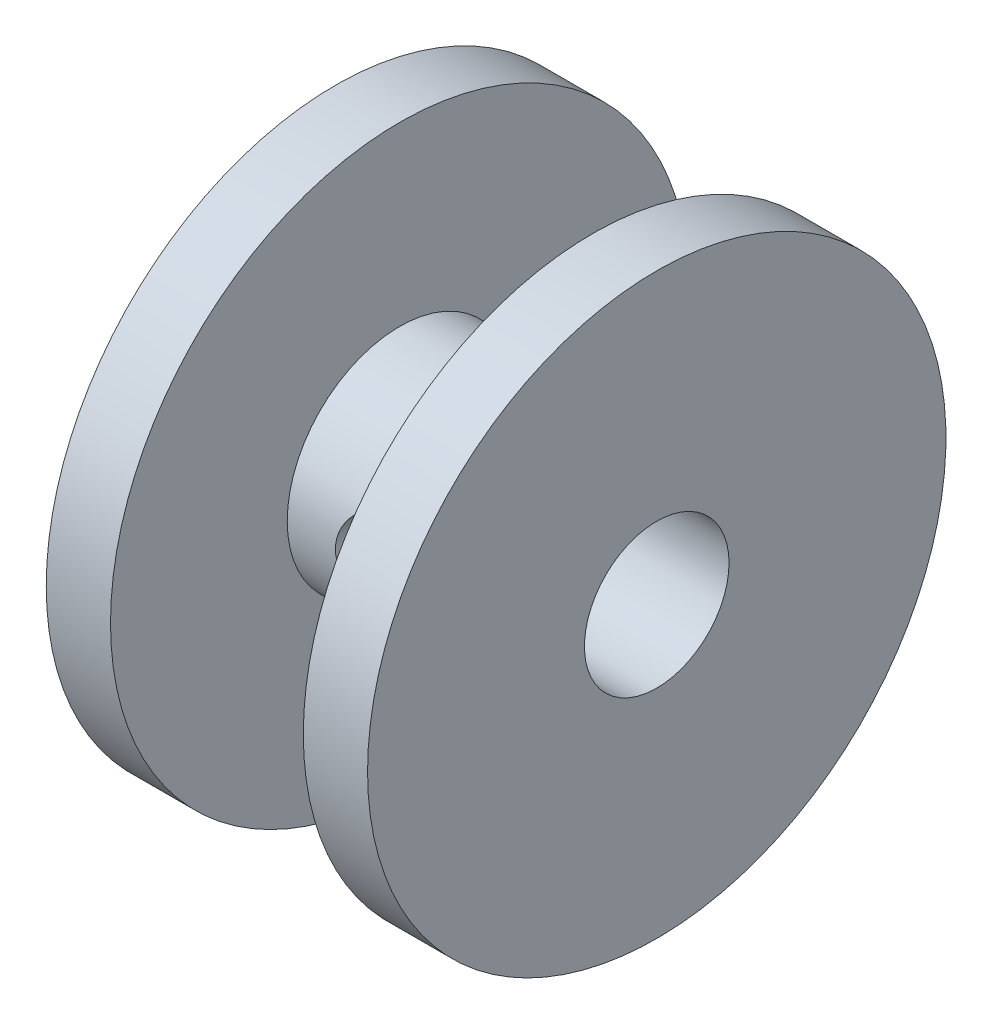
ISO-10303-21;
HEADER;
FILE_DESCRIPTION(('STEP AP214'),'2;1');
FILE_NAME('part.step','',(''),(''),'','','');
FILE_SCHEMA(('AUTOMOTIVE_DESIGN { 1 0 10303 214 1 1 1 1 }'));
ENDSEC;
DATA;
#1=APPLICATION_CONTEXT('core data for automotive mechanical design processes');
#2=APPLICATION_PROTOCOL_DEFINITION('international standard','automotive_design',2000,#1);
#3=PRODUCT_CONTEXT('',#1,'mechanical');
#4=PRODUCT('Part','Part','',(#3));
#5=PRODUCT_RELATED_PRODUCT_CATEGORY('part','',(#4));
#6=PRODUCT_DEFINITION_FORMATION('','',#4);
#7=PRODUCT_DEFINITION_CONTEXT('part definition',#1,'design');
#8=PRODUCT_DEFINITION('design','',#6,#7);
#9=PRODUCT_DEFINITION_SHAPE('','',#8);
#10=(LENGTH_UNIT() NAMED_UNIT(*) SI_UNIT(.MILLI.,.METRE.));
#11=(NAMED_UNIT(*) PLANE_ANGLE_UNIT() SI_UNIT($,.RADIAN.));
#12=(NAMED_UNIT(*) SI_UNIT($,.STERADIAN.) SOLID_ANGLE_UNIT());
#13=UNCERTAINTY_MEASURE_WITH_UNIT(LENGTH_MEASURE(1.E-05),#10,'distance_accuracy_value','');
#14=(GEOMETRIC_REPRESENTATION_CONTEXT(3) GLOBAL_UNCERTAINTY_ASSIGNED_CONTEXT((#13)) GLOBAL_UNIT_ASSIGNED_CONTEXT((#10,
#11,#12)) REPRESENTATION_CONTEXT('',''));
#15=CARTESIAN_POINT('',(0.,0.,0.));
#16=DIRECTION('',(0.,0.,1.));
#17=DIRECTION('',(1.,0.,0.));
#18=AXIS2_PLACEMENT_3D('',#15,#16,#17);
#19=CARTESIAN_POINT('',(-85.1360818211514,-19.2560029817697,0.));
#20=DIRECTION('',(-1.,0.,0.));
#21=DIRECTION('',(0.,0.,1.));
#22=AXIS2_PLACEMENT_3D('',#19,#20,#21);
#23=CYLINDRICAL_SURFACE('',#22,9.);
#24=CARTESIAN_POINT('',(-85.1360818211514,-19.2560029817697,0.));
#25=DIRECTION('',(-1.,0.,0.));
#26=DIRECTION('',(0.,0.,1.));
#27=AXIS2_PLACEMENT_3D('',#24,#25,#26);
#28=CIRCLE('',#27,9.);
#29=CARTESIAN_POINT('',(-85.1360818211514,-19.2560029817697,9.));
#30=VERTEX_POINT('',#29);
#31=EDGE_CURVE('E10',#30,#30,#28,.T.);
#32=ORIENTED_EDGE('',*,*,#31,.F.);
#33=EDGE_LOOP('',(#32));
#34=FACE_BOUND('',#33,.T.);
#35=CARTESIAN_POINT('',(-83.1360818211514,-19.2560029817697,0.));
#36=DIRECTION('',(-1.,0.,0.));
#37=DIRECTION('',(0.,0.,1.));
#38=AXIS2_PLACEMENT_3D('',#35,#36,#37);
#39=CIRCLE('',#38,9.);
#40=CARTESIAN_POINT('',(-83.1360818211514,-19.2560029817697,9.));
#41=VERTEX_POINT('',#40);
#42=EDGE_CURVE('E120',#41,#41,#39,.T.);
#43=ORIENTED_EDGE('',*,*,#42,.T.);
#44=EDGE_LOOP('',(#43));
#45=FACE_BOUND('',#44,.T.);
#46=ADVANCED_FACE('F37',(#34,#45),#23,.T.);
#47=CARTESIAN_POINT('',(-85.1360818211514,-10.2560029817697,0.));
#48=DIRECTION('',(1.,0.,0.));
#49=DIRECTION('',(0.,0.,-1.));
#50=AXIS2_PLACEMENT_3D('',#47,#48,#49);
#51=PLANE('',#50);
#52=CARTESIAN_POINT('',(-85.1360818211514,-19.2560029817697,0.));
#53=DIRECTION('',(1.,0.,0.));
#54=DIRECTION('',(0.,0.,-1.));
#55=AXIS2_PLACEMENT_3D('',#52,#53,#54);
#56=CIRCLE('',#55,2.25);
#57=CARTESIAN_POINT('',(-85.1360818211514,-19.2560029817697,-2.25));
#58=VERTEX_POINT('',#57);
#59=EDGE_CURVE('E117',#58,#58,#56,.T.);
#60=ORIENTED_EDGE('',*,*,#59,.T.);
#61=EDGE_LOOP('',(#60));
#62=FACE_BOUND('',#61,.T.);
#63=ORIENTED_EDGE('',*,*,#31,.T.);
#64=EDGE_LOOP('',(#63));
#65=FACE_BOUND('',#64,.T.);
#66=ADVANCED_FACE('F107',(#62,#65),#51,.F.);
#67=CARTESIAN_POINT('',(-75.1360818211514,-19.2560029817697,0.));
#68=DIRECTION('',(-1.,0.,0.));
#69=DIRECTION('',(0.,0.,1.));
#70=AXIS2_PLACEMENT_3D('',#67,#68,#69);
#71=PLANE('',#70);
#72=CARTESIAN_POINT('',(-75.1360818211514,-19.2560029817697,0.));
#73=DIRECTION('',(1.,0.,0.));
#74=DIRECTION('',(0.,0.,-1.));
#75=AXIS2_PLACEMENT_3D('',#72,#73,#74);
#76=CIRCLE('',#75,2.25);
#77=CARTESIAN_POINT('',(-75.1360818211514,-19.2560029817697,-2.25));
#78=VERTEX_POINT('',#77);
#79=EDGE_CURVE('E121',#78,#78,#76,.T.);
#80=ORIENTED_EDGE('',*,*,#79,.F.);
#81=EDGE_LOOP('',(#80));
#82=FACE_BOUND('',#81,.T.);
#83=CARTESIAN_POINT('',(-75.1360818211514,-19.2560029817697,0.));
#84=DIRECTION('',(-1.,0.,0.));
#85=DIRECTION('',(0.,0.,1.));
#86=AXIS2_PLACEMENT_3D('',#83,#84,#85);
#87=CIRCLE('',#86,9.);
#88=CARTESIAN_POINT('',(-75.1360818211514,-19.2560029817697,9.));
#89=VERTEX_POINT('',#88);
#90=EDGE_CURVE('E50',#89,#89,#87,.T.);
#91=ORIENTED_EDGE('',*,*,#90,.F.);
#92=EDGE_LOOP('',(#91));
#93=FACE_BOUND('',#92,.T.);
#94=ADVANCED_FACE('F104',(#82,#93),#71,.F.);
#95=CARTESIAN_POINT('',(-85.1360818211514,-19.2560029817697,0.));
#96=DIRECTION('',(-1.,0.,0.));
#97=DIRECTION('',(0.,0.,1.));
#98=AXIS2_PLACEMENT_3D('',#95,#96,#97);
#99=CYLINDRICAL_SURFACE('',#98,9.);
#100=CARTESIAN_POINT('',(-77.1360818211514,-19.2560029817697,0.));
#101=DIRECTION('',(-1.,0.,0.));
#102=DIRECTION('',(0.,0.,1.));
#103=AXIS2_PLACEMENT_3D('',#100,#101,#102);
#104=CIRCLE('',#103,9.);
#105=CARTESIAN_POINT('',(-77.1360818211514,-19.2560029817697,9.));
#106=VERTEX_POINT('',#105);
#107=EDGE_CURVE('E56',#106,#106,#104,.T.);
#108=ORIENTED_EDGE('',*,*,#107,.F.);
#109=EDGE_LOOP('',(#108));
#110=FACE_BOUND('',#109,.T.);
#111=ORIENTED_EDGE('',*,*,#90,.T.);
#112=EDGE_LOOP('',(#111));
#113=FACE_BOUND('',#112,.T.);
#114=ADVANCED_FACE('F100',(#110,#113),#99,.T.);
#115=CARTESIAN_POINT('',(-77.1360818211514,-10.2560029817697,0.));
#116=DIRECTION('',(1.,0.,0.));
#117=DIRECTION('',(0.,0.,-1.));
#118=AXIS2_PLACEMENT_3D('',#115,#116,#117);
#119=PLANE('',#118);
#120=CARTESIAN_POINT('',(-77.1360818211514,-19.2560029817697,0.));
#121=DIRECTION('',(-1.,0.,0.));
#122=DIRECTION('',(0.,0.,1.));
#123=AXIS2_PLACEMENT_3D('',#120,#121,#122);
#124=CIRCLE('',#123,3.5);
#125=CARTESIAN_POINT('',(-77.1360818211514,-19.2560029817697,3.5));
#126=VERTEX_POINT('',#125);
#127=EDGE_CURVE('E133',#126,#126,#124,.T.);
#128=ORIENTED_EDGE('',*,*,#127,.F.);
#129=EDGE_LOOP('',(#128));
#130=FACE_BOUND('',#129,.T.);
#131=ORIENTED_EDGE('',*,*,#107,.T.);
#132=EDGE_LOOP('',(#131));
#133=FACE_BOUND('',#132,.T.);
#134=ADVANCED_FACE('F95',(#130,#133),#119,.F.);
#135=CARTESIAN_POINT('',(-85.1360818211514,-19.2560029817697,0.));
#136=DIRECTION('',(-1.,0.,0.));
#137=DIRECTION('',(0.,0.,1.));
#138=AXIS2_PLACEMENT_3D('',#135,#136,#137);
#139=CYLINDRICAL_SURFACE('',#138,3.5);
#140=CARTESIAN_POINT('',(-78.6360818211514,-19.2560029817697,3.5));
#141=CARTESIAN_POINT('',(-78.6360910425904,-19.3361551794521,3.49999299268885));
#142=CARTESIAN_POINT('',(-78.642543950907,-19.4164229739679,3.4972151640971));
#143=CARTESIAN_POINT('',(-78.6681215284368,-19.5746745931309,3.48637069204866));
#144=CARTESIAN_POINT('',(-78.687278190941,-19.6526521308603,3.47829069608752));
#145=CARTESIAN_POINT('',(-78.7374170963504,-19.8037711465161,3.45770786336707));
#146=CARTESIAN_POINT('',(-78.7683583486141,-19.8769283679164,3.44522036823866));
#147=CARTESIAN_POINT('',(-78.8410139249019,-20.0169394278416,3.4170283792682));
#148=CARTESIAN_POINT('',(-78.8827253303024,-20.0837949673811,3.4013247572084));
#149=CARTESIAN_POINT('',(-78.9780456752767,-20.2129237653158,3.36733908702934));
#150=CARTESIAN_POINT('',(-79.0321294592291,-20.2748232260221,3.34896947381214));
#151=CARTESIAN_POINT('',(-79.1496537472676,-20.388998166139,3.3120882776969));
#152=CARTESIAN_POINT('',(-79.2130994112217,-20.4412683023263,3.29357662187922));
#153=CARTESIAN_POINT('',(-79.3515981848579,-20.5374314172515,3.25741027462364));
#154=CARTESIAN_POINT('',(-79.4270870507939,-20.5807370418298,3.23985230076501));
#155=CARTESIAN_POINT('',(-79.5851365346184,-20.6538689775139,3.2089808436345));
#156=CARTESIAN_POINT('',(-79.6676932732315,-20.6837026271433,3.19566505070703));
#157=CARTESIAN_POINT('',(-79.8332321904608,-20.727477581684,3.17573899533535));
#158=CARTESIAN_POINT('',(-79.9159856720788,-20.7421404538666,3.16882610719818));
#159=CARTESIAN_POINT('',(-80.083044805919,-20.7574060174736,3.1616242484202));
#160=CARTESIAN_POINT('',(-80.1673494988013,-20.7580171248153,3.16133131294301));
#161=CARTESIAN_POINT('',(-80.3277317730002,-20.7457029793506,3.16714786968021));
#162=CARTESIAN_POINT('',(-80.4039171327577,-20.7338835508779,3.17273435527609));
#163=CARTESIAN_POINT('',(-80.5530956140404,-20.698906845835,3.18879205821457));
#164=CARTESIAN_POINT('',(-80.6260880780802,-20.6757472459419,3.19926427650311));
#165=CARTESIAN_POINT('',(-80.7687053968892,-20.6182912771162,3.22415342810444));
#166=CARTESIAN_POINT('',(-80.8382219682659,-20.58376285391,3.23865147551049));
#167=CARTESIAN_POINT('',(-80.9707549831807,-20.5047145061366,3.26994246945714));
#168=CARTESIAN_POINT('',(-81.0337687686146,-20.4601905191726,3.2867363479811));
#169=CARTESIAN_POINT('',(-81.1574705729637,-20.3577200087303,3.32256202266195));
#170=CARTESIAN_POINT('',(-81.2174401858878,-20.2989266260502,3.34165927694226));
#171=CARTESIAN_POINT('',(-81.3269176164789,-20.1719396437952,3.3786730287964));
#172=CARTESIAN_POINT('',(-81.3764226940904,-20.1037435899097,3.39658921627429));
#173=CARTESIAN_POINT('',(-81.464703787555,-19.957595893276,3.4297984684468));
#174=CARTESIAN_POINT('',(-81.5031713305042,-19.8794385566208,3.44501227516836));
#175=CARTESIAN_POINT('',(-81.5661569399587,-19.7169428288492,3.47048698130307));
#176=CARTESIAN_POINT('',(-81.5906831741403,-19.6326080895985,3.48075078019998));
#177=CARTESIAN_POINT('',(-81.6235487513809,-19.4661411012404,3.49461763446686));
#178=CARTESIAN_POINT('',(-81.6328512038086,-19.3842319622751,3.49861624982293));
#179=CARTESIAN_POINT('',(-81.6378966093555,-19.2199313312104,3.50077708325871));
#180=CARTESIAN_POINT('',(-81.6336437474176,-19.1375399958194,3.49894110265833));
#181=CARTESIAN_POINT('',(-81.612374005124,-18.9792317619564,3.48989338160075));
#182=CARTESIAN_POINT('',(-81.5960476604272,-18.9032035160177,3.48297259736823));
#183=CARTESIAN_POINT('',(-81.5520713740324,-18.7550574135734,3.46476944004986));
#184=CARTESIAN_POINT('',(-81.5244200232905,-18.6829400449192,3.45348652424256));
#185=CARTESIAN_POINT('',(-81.4576812414002,-18.5421144991507,3.42719375756865));
#186=CARTESIAN_POINT('',(-81.4182636560378,-18.4735831070121,3.41207852694255));
#187=CARTESIAN_POINT('',(-81.329472348914,-18.3438605289445,3.37971494195702));
#188=CARTESIAN_POINT('',(-81.280094377142,-18.2826724941985,3.36246567824313));
#189=CARTESIAN_POINT('',(-81.1684370272276,-18.1645191841133,3.32607394349024));
#190=CARTESIAN_POINT('',(-81.1054657161115,-18.1082198940269,3.30688677499573));
#191=CARTESIAN_POINT('',(-80.9706906718448,-18.0067858245257,3.26992018844849));
#192=CARTESIAN_POINT('',(-80.8988844909984,-17.9616541495677,3.2521411627736));
#193=CARTESIAN_POINT('',(-80.7466748946371,-17.8831836037058,3.21981484643716));
#194=CARTESIAN_POINT('',(-80.6661403164946,-17.8500709070361,3.20533127997695));
#195=CARTESIAN_POINT('',(-80.4998186579134,-17.7981735562608,3.18206803761104));
#196=CARTESIAN_POINT('',(-80.4140363224808,-17.7793761592699,3.17328328988834));
#197=CARTESIAN_POINT('',(-80.2470862345328,-17.7579432409306,3.16321740581936));
#198=CARTESIAN_POINT('',(-80.1661021857716,-17.7541295201072,3.16138962881681));
#199=CARTESIAN_POINT('',(-80.0046869493199,-17.7595897309118,3.16397809086752));
#200=CARTESIAN_POINT('',(-79.9242556666361,-17.7688613542828,3.16839322866984));
#201=CARTESIAN_POINT('',(-79.7705609672852,-17.7992208407753,3.1824582711803));
#202=CARTESIAN_POINT('',(-79.6971424045041,-17.8196681616359,3.19182357178317));
#203=CARTESIAN_POINT('',(-79.5547714589774,-17.8711518117653,3.2144943728719));
#204=CARTESIAN_POINT('',(-79.4858203526981,-17.9021911517073,3.22780099349553));
#205=CARTESIAN_POINT('',(-79.3496713842431,-17.9761869594995,3.25787626150961));
#206=CARTESIAN_POINT('',(-79.2828469273312,-18.019762704642,3.27480834339631));
#207=CARTESIAN_POINT('',(-79.1570909576205,-18.1167540929566,3.30979879908541));
#208=CARTESIAN_POINT('',(-79.0981624436074,-18.1701734564267,3.32785759700648));
#209=CARTESIAN_POINT('',(-78.985078723837,-18.2903313062279,3.36477750877144));
#210=CARTESIAN_POINT('',(-78.9316670872829,-18.3577881637883,3.38358948911939));
#211=CARTESIAN_POINT('',(-78.8368668944583,-18.5013903680627,3.41848089249469));
#212=CARTESIAN_POINT('',(-78.7954837894016,-18.577539632387,3.43455907522588));
#213=CARTESIAN_POINT('',(-78.7267372515807,-18.7353761788731,3.46197513636854));
#214=CARTESIAN_POINT('',(-78.6991782911721,-18.8169665789115,3.47337868320289));
#215=CARTESIAN_POINT('',(-78.6584471063842,-18.9840773243653,3.49042295491409));
#216=CARTESIAN_POINT('',(-78.6452303115048,-19.0695846290584,3.49608152963086));
#217=CARTESIAN_POINT('',(-78.6372013101974,-19.1889762211565,3.49952115812385));
#218=CARTESIAN_POINT('',(-78.6360779643036,-19.2224794907089,3.50000293079341));
#219=CARTESIAN_POINT('',(-78.6360818211514,-19.2560029817697,3.5));
#220=B_SPLINE_CURVE_WITH_KNOTS('',3,(#140,#141,#142,#143,#144,#145,#146,#147,#148,#149,#150,
#151,#152,#153,#154,#155,#156,#157,#158,#159,#160,#161,#162,#163,#164,#165,#166,#167,#168,#169,
#170,#171,#172,#173,#174,#175,#176,#177,#178,#179,#180,#181,#182,#183,#184,#185,#186,#187,#188,
#189,#190,#191,#192,#193,#194,#195,#196,#197,#198,#199,#200,#201,#202,#203,#204,#205,#206,#207,
#208,#209,#210,#211,#212,#213,#214,#215,#216,#217,#218,#219),.UNSPECIFIED.,.T.,.F.,(4,2,2,2,2,2,
2,2,2,2,2,2,2,2,2,2,2,2,2,2,2,2,2,2,2,2,2,2,2,2,2,2,2,2,2,2,2,2,2,4),(0.,0.240357161374428,
0.481321951711675,0.721456131375715,0.961525304807657,1.21311371779254,1.46484131710872,
1.72984780430032,1.99470976114131,2.2462971341405,2.49773382188957,2.72855360159807,
2.95942069041216,3.19532704432403,3.43132944942385,3.68854918859161,3.94583619550722,
4.20973622296858,4.47348148178613,4.71978673747256,4.96601595851026,5.19915597113058,
5.43232499957122,5.67277527577345,5.91332836788289,6.17201425189603,6.43077196675482,
6.69417345394932,6.95734019712949,7.19934244432577,7.44130200762142,7.67066022550941,
7.90008369050322,8.14372375039557,8.38745608120076,8.65042084666958,8.91350460007055,
9.17275427816964,9.43119596989052,9.53172485598108),.UNSPECIFIED.);
#221=CARTESIAN_POINT('',(-78.6360818211514,-19.2560029817697,3.5));
#222=VERTEX_POINT('',#221);
#223=EDGE_CURVE('E85',#222,#222,#220,.T.);
#224=ORIENTED_EDGE('',*,*,#223,.T.);
#225=EDGE_LOOP('',(#224));
#226=FACE_BOUND('',#225,.T.);
#227=CARTESIAN_POINT('',(-78.6360818211514,-19.2560029817697,-3.5));
#228=CARTESIAN_POINT('',(-78.6360910425904,-19.1758507840873,-3.49999299268885));
#229=CARTESIAN_POINT('',(-78.642543950907,-19.0955829895714,-3.4972151640971));
#230=CARTESIAN_POINT('',(-78.6681215284368,-18.9373313704085,-3.48637069204866));
#231=CARTESIAN_POINT('',(-78.687278190941,-18.8593538326791,-3.47829069608752));
#232=CARTESIAN_POINT('',(-78.7374170963504,-18.7082348170233,-3.45770786336707));
#233=CARTESIAN_POINT('',(-78.7683583486141,-18.6350775956229,-3.44522036823866));
#234=CARTESIAN_POINT('',(-78.8410139249019,-18.4950665356978,-3.4170283792682));
#235=CARTESIAN_POINT('',(-78.8827253303024,-18.4282109961583,-3.4013247572084));
#236=CARTESIAN_POINT('',(-78.9780456752767,-18.2990821982235,-3.36733908702935));
#237=CARTESIAN_POINT('',(-79.0321294592291,-18.2371827375172,-3.34896947381214));
#238=CARTESIAN_POINT('',(-79.1496537472676,-18.1230077974004,-3.3120882776969));
#239=CARTESIAN_POINT('',(-79.2130994112217,-18.070737661213,-3.29357662187922));
#240=CARTESIAN_POINT('',(-79.3515981848579,-17.9745745462878,-3.25741027462364));
#241=CARTESIAN_POINT('',(-79.4270870507939,-17.9312689217095,-3.23985230076501));
#242=CARTESIAN_POINT('',(-79.5851365346184,-17.8581369860254,-3.2089808436345));
#243=CARTESIAN_POINT('',(-79.6676932732315,-17.828303336396,-3.19566505070703));
#244=CARTESIAN_POINT('',(-79.8332321904608,-17.7845283818553,-3.17573899533535));
#245=CARTESIAN_POINT('',(-79.9159856720788,-17.7698655096727,-3.16882610719818));
#246=CARTESIAN_POINT('',(-80.083044805919,-17.7545999460657,-3.1616242484202));
#247=CARTESIAN_POINT('',(-80.1673494988013,-17.753988838724,-3.16133131294302));
#248=CARTESIAN_POINT('',(-80.3277317730002,-17.7663029841887,-3.16714786968022));
#249=CARTESIAN_POINT('',(-80.4039171327577,-17.7781224126614,-3.17273435527609));
#250=CARTESIAN_POINT('',(-80.5530956140404,-17.8130991177044,-3.18879205821457));
#251=CARTESIAN_POINT('',(-80.6260880780802,-17.8362587175974,-3.19926427650311));
#252=CARTESIAN_POINT('',(-80.7687053968892,-17.8937146864231,-3.22415342810444));
#253=CARTESIAN_POINT('',(-80.8382219682659,-17.9282431096294,-3.23865147551049));
#254=CARTESIAN_POINT('',(-80.9707549831807,-18.0072914574028,-3.26994246945714));
#255=CARTESIAN_POINT('',(-81.0337687686146,-18.0518154443667,-3.2867363479811));
#256=CARTESIAN_POINT('',(-81.1574705729638,-18.1542859548091,-3.32256202266195));
#257=CARTESIAN_POINT('',(-81.2174401858878,-18.2130793374892,-3.34165927694226));
#258=CARTESIAN_POINT('',(-81.3269176164789,-18.3400663197442,-3.37867302879641));
#259=CARTESIAN_POINT('',(-81.3764226940904,-18.4082623736297,-3.39658921627429));
#260=CARTESIAN_POINT('',(-81.464703787555,-18.5544100702634,-3.4297984684468));
#261=CARTESIAN_POINT('',(-81.5031713305042,-18.6325674069185,-3.44501227516836));
#262=CARTESIAN_POINT('',(-81.5661569399587,-18.7950631346902,-3.47048698130307));
#263=CARTESIAN_POINT('',(-81.5906831741403,-18.8793978739408,-3.48075078019998));
#264=CARTESIAN_POINT('',(-81.6235487513809,-19.045864862299,-3.49461763446686));
#265=CARTESIAN_POINT('',(-81.6328512038086,-19.1277740012642,-3.49861624982293));
#266=CARTESIAN_POINT('',(-81.6378966093555,-19.2920746323289,-3.50077708325871));
#267=CARTESIAN_POINT('',(-81.6336437474176,-19.37446596772,-3.49894110265833));
#268=CARTESIAN_POINT('',(-81.612374005124,-19.532774201583,-3.48989338160075));
#269=CARTESIAN_POINT('',(-81.5960476604272,-19.6088024475217,-3.48297259736823));
#270=CARTESIAN_POINT('',(-81.5520713740324,-19.756948549966,-3.46476944004986));
#271=CARTESIAN_POINT('',(-81.5244200232905,-19.8290659186201,-3.45348652424256));
#272=CARTESIAN_POINT('',(-81.4576812414002,-19.9698914643887,-3.42719375756865));
#273=CARTESIAN_POINT('',(-81.4182636560378,-20.0384228565272,-3.41207852694255));
#274=CARTESIAN_POINT('',(-81.329472348914,-20.1681454345949,-3.37971494195701));
#275=CARTESIAN_POINT('',(-81.280094377142,-20.2293334693408,-3.36246567824312));
#276=CARTESIAN_POINT('',(-81.1684370272276,-20.347486779426,-3.32607394349023));
#277=CARTESIAN_POINT('',(-81.1054657161115,-20.4037860695125,-3.30688677499573));
#278=CARTESIAN_POINT('',(-80.9706906718448,-20.5052201390137,-3.26992018844849));
#279=CARTESIAN_POINT('',(-80.8988844909984,-20.5503518139716,-3.25214116277359));
#280=CARTESIAN_POINT('',(-80.7466748946371,-20.6288223598335,-3.21981484643715));
#281=CARTESIAN_POINT('',(-80.6661403164946,-20.6619350565032,-3.20533127997694));
#282=CARTESIAN_POINT('',(-80.4998186579134,-20.7138324072786,-3.18206803761104));
#283=CARTESIAN_POINT('',(-80.4140363224808,-20.7326298042695,-3.17328328988834));
#284=CARTESIAN_POINT('',(-80.2470862345328,-20.7540627226087,-3.16321740581935));
#285=CARTESIAN_POINT('',(-80.1661021857716,-20.7578764434321,-3.16138962881681));
#286=CARTESIAN_POINT('',(-80.0046869493199,-20.7524162326276,-3.16397809086751));
#287=CARTESIAN_POINT('',(-79.9242556666361,-20.7431446092565,-3.16839322866983));
#288=CARTESIAN_POINT('',(-79.7705609672852,-20.712785122764,-3.1824582711803));
#289=CARTESIAN_POINT('',(-79.6971424045041,-20.6923378019035,-3.19182357178317));
#290=CARTESIAN_POINT('',(-79.5547714589774,-20.640854151774,-3.21449437287189));
#291=CARTESIAN_POINT('',(-79.4858203526981,-20.6098148118321,-3.22780099349553));
#292=CARTESIAN_POINT('',(-79.3496713842431,-20.5358190040399,-3.25787626150961));
#293=CARTESIAN_POINT('',(-79.2828469273312,-20.4922432588973,-3.27480834339631));
#294=CARTESIAN_POINT('',(-79.1570909576205,-20.3952518705827,-3.30979879908541));
#295=CARTESIAN_POINT('',(-79.0981624436074,-20.3418325071126,-3.32785759700647));
#296=CARTESIAN_POINT('',(-78.985078723837,-20.2216746573114,-3.36477750877144));
#297=CARTESIAN_POINT('',(-78.9316670872829,-20.154217799751,-3.38358948911939));
#298=CARTESIAN_POINT('',(-78.8368668944583,-20.0106155954766,-3.41848089249469));
#299=CARTESIAN_POINT('',(-78.7954837894016,-19.9344663311524,-3.43455907522587));
#300=CARTESIAN_POINT('',(-78.7267372515807,-19.7766297846662,-3.46197513636854));
#301=CARTESIAN_POINT('',(-78.6991782911721,-19.6950393846279,-3.47337868320289));
#302=CARTESIAN_POINT('',(-78.6584471063842,-19.527928639174,-3.49042295491409));
#303=CARTESIAN_POINT('',(-78.6452303115048,-19.442421334481,-3.49608152963086));
#304=CARTESIAN_POINT('',(-78.6372013101974,-19.3230297423829,-3.49952115812385));
#305=CARTESIAN_POINT('',(-78.6360779643036,-19.2895264728304,-3.50000293079341));
#306=CARTESIAN_POINT('',(-78.6360818211514,-19.2560029817697,-3.5));
#307=B_SPLINE_CURVE_WITH_KNOTS('',3,(#227,#228,#229,#230,#231,#232,#233,#234,#235,#236,#237,
#238,#239,#240,#241,#242,#243,#244,#245,#246,#247,#248,#249,#250,#251,#252,#253,#254,#255,#256,
#257,#258,#259,#260,#261,#262,#263,#264,#265,#266,#267,#268,#269,#270,#271,#272,#273,#274,#275,
#276,#277,#278,#279,#280,#281,#282,#283,#284,#285,#286,#287,#288,#289,#290,#291,#292,#293,#294,
#295,#296,#297,#298,#299,#300,#301,#302,#303,#304,#305,#306),.UNSPECIFIED.,.T.,.F.,(4,2,2,2,2,2,
2,2,2,2,2,2,2,2,2,2,2,2,2,2,2,2,2,2,2,2,2,2,2,2,2,2,2,2,2,2,2,2,2,4),(0.,0.240357161374428,
0.481321951711675,0.721456131375712,0.961525304807654,1.21311371779254,1.46484131710872,
1.72984780430032,1.99470976114131,2.24629713414049,2.49773382188958,2.72855360159807,
2.95942069041216,3.19532704432402,3.43132944942385,3.68854918859162,3.94583619550724,
4.20973622296858,4.47348148178613,4.71978673747255,4.96601595851025,5.19915597113058,
5.43232499957122,5.67277527577345,5.91332836788289,6.17201425189602,6.43077196675482,
6.69417345394932,6.95734019712949,7.19934244432577,7.44130200762142,7.67066022550941,
7.90008369050322,8.14372375039557,8.38745608120076,8.65042084666958,8.91350460007055,
9.17275427816964,9.43119596989052,9.53172485598108),.UNSPECIFIED.);
#308=CARTESIAN_POINT('',(-78.6360818211514,-19.2560029817697,-3.5));
#309=VERTEX_POINT('',#308);
#310=EDGE_CURVE('E78',#309,#309,#307,.T.);
#311=ORIENTED_EDGE('',*,*,#310,.T.);
#312=EDGE_LOOP('',(#311));
#313=FACE_BOUND('',#312,.T.);
#314=CARTESIAN_POINT('',(-83.1360818211514,-19.2560029817697,0.));
#315=DIRECTION('',(-1.,0.,0.));
#316=DIRECTION('',(0.,0.,1.));
#317=AXIS2_PLACEMENT_3D('',#314,#315,#316);
#318=CIRCLE('',#317,3.5);
#319=CARTESIAN_POINT('',(-83.1360818211514,-19.2560029817697,3.5));
#320=VERTEX_POINT('',#319);
#321=EDGE_CURVE('E125',#320,#320,#318,.T.);
#322=ORIENTED_EDGE('',*,*,#321,.F.);
#323=EDGE_LOOP('',(#322));
#324=FACE_BOUND('',#323,.T.);
#325=ORIENTED_EDGE('',*,*,#127,.T.);
#326=EDGE_LOOP('',(#325));
#327=FACE_BOUND('',#326,.T.);
#328=ADVANCED_FACE('F90',(#226,#313,#324,#327),#139,.T.);
#329=CARTESIAN_POINT('',(-83.1360818211514,-15.7560029817697,0.));
#330=DIRECTION('',(-1.,0.,0.));
#331=DIRECTION('',(0.,0.,1.));
#332=AXIS2_PLACEMENT_3D('',#329,#330,#331);
#333=PLANE('',#332);
#334=ORIENTED_EDGE('',*,*,#42,.F.);
#335=EDGE_LOOP('',(#334));
#336=FACE_BOUND('',#335,.T.);
#337=ORIENTED_EDGE('',*,*,#321,.T.);
#338=EDGE_LOOP('',(#337));
#339=FACE_BOUND('',#338,.T.);
#340=ADVANCED_FACE('F94',(#336,#339),#333,.F.);
#341=CARTESIAN_POINT('',(-85.1360818211514,-19.2560029817697,0.));
#342=DIRECTION('',(1.,0.,0.));
#343=DIRECTION('',(0.,0.,-1.));
#344=AXIS2_PLACEMENT_3D('',#341,#342,#343);
#345=CYLINDRICAL_SURFACE('',#344,2.25);
#346=CARTESIAN_POINT('',(-81.6360818211514,-19.2560029817697,-2.25));
#347=CARTESIAN_POINT('',(-81.6360822333758,-19.1806394442686,-2.2500003123363));
#348=CARTESIAN_POINT('',(-81.6303713436848,-19.10527616642,-2.24618102065041));
#349=CARTESIAN_POINT('',(-81.6078841730722,-18.9569531882459,-2.23128489317856));
#350=CARTESIAN_POINT('',(-81.5911026388089,-18.8839946463034,-2.22020461185926));
#351=CARTESIAN_POINT('',(-81.5475010331578,-18.742843750879,-2.19187861803531));
#352=CARTESIAN_POINT('',(-81.5207279661455,-18.6746308272765,-2.17466179119986));
#353=CARTESIAN_POINT('',(-81.4582842986978,-18.5439415135217,-2.1354460340808));
#354=CARTESIAN_POINT('',(-81.422612406426,-18.4814659580624,-2.11344640954132));
#355=CARTESIAN_POINT('',(-81.3400891181258,-18.3580394561921,-2.06420497027379));
#356=CARTESIAN_POINT('',(-81.2925459255942,-18.2976677526742,-2.0366767318449));
#357=CARTESIAN_POINT('',(-81.1892842846576,-18.1852069482501,-1.97986734812599));
#358=CARTESIAN_POINT('',(-81.1335541237731,-18.1331299401905,-1.95058372767623));
#359=CARTESIAN_POINT('',(-81.0052925454419,-18.0303357486785,-1.88796198509096));
#360=CARTESIAN_POINT('',(-80.9314975812488,-17.981129084049,-1.85471300953349));
#361=CARTESIAN_POINT('',(-80.7748092879165,-17.8958753041634,-1.79313110514612));
#362=CARTESIAN_POINT('',(-80.6919320199793,-17.8598054310709,-1.7647897196599));
#363=CARTESIAN_POINT('',(-80.5435483510852,-17.8109477191839,-1.72482199981103));
#364=CARTESIAN_POINT('',(-80.479935481496,-17.7944446274996,-1.71073220919327));
#365=CARTESIAN_POINT('',(-80.3500234425951,-17.7698733483805,-1.68943477244679));
#366=CARTESIAN_POINT('',(-80.2837291096066,-17.7617906218802,-1.6822152655802));
#367=CARTESIAN_POINT('',(-80.1499757370093,-17.7545677507102,-1.67577454206125));
#368=CARTESIAN_POINT('',(-80.082513053563,-17.7554641598874,-1.67658601919218));
#369=CARTESIAN_POINT('',(-79.9488555910257,-17.7662211217704,-1.68614831612228));
#370=CARTESIAN_POINT('',(-79.8826619346269,-17.77608926892,-1.69490586213888));
#371=CARTESIAN_POINT('',(-79.7562315327232,-17.8035155251366,-1.71845389493687));
#372=CARTESIAN_POINT('',(-79.6958608192091,-17.8207151456622,-1.7329611624773));
#373=CARTESIAN_POINT('',(-79.5788140529078,-17.8619770924054,-1.76632217195768));
#374=CARTESIAN_POINT('',(-79.5221392234285,-17.8860416768481,-1.78517734374583));
#375=CARTESIAN_POINT('',(-79.4018127746897,-17.9459493412222,-1.82973147303319));
#376=CARTESIAN_POINT('',(-79.3390868960103,-17.9831925893039,-1.85604238386761));
#377=CARTESIAN_POINT('',(-79.2200442749135,-18.0659857782649,-1.91018653383726));
#378=CARTESIAN_POINT('',(-79.1637355778957,-18.1115459642092,-1.93802162056421));
#379=CARTESIAN_POINT('',(-79.046674911868,-18.2211442419301,-1.99907507793144));
#380=CARTESIAN_POINT('',(-78.9875812846178,-18.287048444663,-2.03216058532538));
#381=CARTESIAN_POINT('',(-78.881184450269,-18.429496982439,-2.09413575506786));
#382=CARTESIAN_POINT('',(-78.8338702120998,-18.506031257257,-2.12302933237928));
#383=CARTESIAN_POINT('',(-78.7609735321801,-18.6523596114513,-2.16859053066249));
#384=CARTESIAN_POINT('',(-78.7329492986461,-18.7205347492418,-2.18654445873747));
#385=CARTESIAN_POINT('',(-78.6870031269335,-18.861475948817,-2.21630789273282));
#386=CARTESIAN_POINT('',(-78.6690726508026,-18.9342380725182,-2.22812259095767));
#387=CARTESIAN_POINT('',(-78.6442109472226,-19.0827638918908,-2.24456911617496));
#388=CARTESIAN_POINT('',(-78.6373272254476,-19.1585391228191,-2.24916991845861));
#389=CARTESIAN_POINT('',(-78.6351465047298,-19.3103341213116,-2.25062336223889));
#390=CARTESIAN_POINT('',(-78.6398486957848,-19.3863538714096,-2.24747654539233));
#391=CARTESIAN_POINT('',(-78.6597998628229,-19.5308447696729,-2.23424692068197));
#392=CARTESIAN_POINT('',(-78.6742847944678,-19.5994710652791,-2.22466684792667));
#393=CARTESIAN_POINT('',(-78.7122785856611,-19.7330902760902,-2.19988836963629));
#394=CARTESIAN_POINT('',(-78.7357888843476,-19.798082609948,-2.18468906810241));
#395=CARTESIAN_POINT('',(-78.7925710439351,-19.9270015446192,-2.14872264396867));
#396=CARTESIAN_POINT('',(-78.8263479367128,-19.9906251202432,-2.12767402601838));
#397=CARTESIAN_POINT('',(-78.9019067886111,-20.1115152497376,-2.08201391708633));
#398=CARTESIAN_POINT('',(-78.9436936915505,-20.1687778429204,-2.05740022802955));
#399=CARTESIAN_POINT('',(-79.0415377222695,-20.2848938228871,-2.00215909990072));
#400=CARTESIAN_POINT('',(-79.0988065162077,-20.3425668885414,-1.97119617600123));
#401=CARTESIAN_POINT('',(-79.2219153936193,-20.4480077422905,-1.90928379814467));
#402=CARTESIAN_POINT('',(-79.2877613504821,-20.4957686841989,-1.87833436813383));
#403=CARTESIAN_POINT('',(-79.4214386307275,-20.5769388058895,-1.82204759227934));
#404=CARTESIAN_POINT('',(-79.4886308462481,-20.6112202527093,-1.79645697769275));
#405=CARTESIAN_POINT('',(-79.6289863104841,-20.6697245848217,-1.75079230699615));
#406=CARTESIAN_POINT('',(-79.7021385248799,-20.6939655743861,-1.73070834397366));
#407=CARTESIAN_POINT('',(-79.839505186548,-20.7277718077597,-1.70199906136974));
#408=CARTESIAN_POINT('',(-79.9029606785584,-20.7391924635164,-1.69196248515942));
#409=CARTESIAN_POINT('',(-80.0315117821402,-20.753747026195,-1.67909599828798));
#410=CARTESIAN_POINT('',(-80.096605534506,-20.7568899339096,-1.67625826010862));
#411=CARTESIAN_POINT('',(-80.2265641136942,-20.7546823966292,-1.67823150862486));
#412=CARTESIAN_POINT('',(-80.2914287821817,-20.749326922528,-1.68304702430597));
#413=CARTESIAN_POINT('',(-80.4190894675505,-20.7304804609553,-1.69957839302618));
#414=CARTESIAN_POINT('',(-80.4818826065197,-20.7169786197316,-1.71130345145711));
#415=CARTESIAN_POINT('',(-80.6203652110123,-20.6779507492009,-1.743951329286));
#416=CARTESIAN_POINT('',(-80.6950326058589,-20.6501793852504,-1.76649250181237));
#417=CARTESIAN_POINT('',(-80.8376969469396,-20.5841369285413,-1.81666620840982));
#418=CARTESIAN_POINT('',(-80.9056843446452,-20.5458510943291,-1.84430587265024));
#419=CARTESIAN_POINT('',(-81.0355432365036,-20.4589900859333,-1.90212889932839));
#420=CARTESIAN_POINT('',(-81.0972808802187,-20.4102403059748,-1.9323494054421));
#421=CARTESIAN_POINT('',(-81.2125736798449,-20.3035412420029,-1.99221226153383));
#422=CARTESIAN_POINT('',(-81.2661263189233,-20.2455891394628,-2.02185443124297));
#423=CARTESIAN_POINT('',(-81.3711158993832,-20.112095979097,-2.08223663973061));
#424=CARTESIAN_POINT('',(-81.4211458012851,-20.0352242339365,-2.11252354087493));
#425=CARTESIAN_POINT('',(-81.5070167786504,-19.8716543985981,-2.16583249405621));
#426=CARTESIAN_POINT('',(-81.5428801512694,-19.7849720286065,-2.18886595083941));
#427=CARTESIAN_POINT('',(-81.5919477547742,-19.6245792841465,-2.22076233627671));
#428=CARTESIAN_POINT('',(-81.6084151004754,-19.5522622257131,-2.23163610276701));
#429=CARTESIAN_POINT('',(-81.630477845555,-19.4052964907876,-2.2462521010639));
#430=CARTESIAN_POINT('',(-81.6360814128484,-19.3306496089107,-2.24999969063486));
#431=CARTESIAN_POINT('',(-81.6360818211514,-19.2560029817697,-2.25));
#432=B_SPLINE_CURVE_WITH_KNOTS('',3,(#346,#347,#348,#349,#350,#351,#352,#353,#354,#355,#356,
#357,#358,#359,#360,#361,#362,#363,#364,#365,#366,#367,#368,#369,#370,#371,#372,#373,#374,#375,
#376,#377,#378,#379,#380,#381,#382,#383,#384,#385,#386,#387,#388,#389,#390,#391,#392,#393,#394,
#395,#396,#397,#398,#399,#400,#401,#402,#403,#404,#405,#406,#407,#408,#409,#410,#411,#412,#413,
#414,#415,#416,#417,#418,#419,#420,#421,#422,#423,#424,#425,#426,#427,#428,#429,#430,#431),
.UNSPECIFIED.,.T.,.F.,(4,2,2,2,2,2,2,2,2,2,2,2,2,2,2,2,2,2,2,2,2,2,2,2,2,2,2,2,2,2,2,2,2,2,2,2,
2,2,2,2,2,2,4),(0.,0.225789919879051,0.451687060761517,0.676534614892679,0.9014148290054,
1.14537771750418,1.38969308703239,1.67255012471987,1.95491479084079,2.15575270257022,
2.35624325884356,2.55755033801531,2.75902797947513,2.95161646648516,3.14426837853808,
3.37610680994696,3.6082327783382,3.89039215871342,4.17228630224798,4.39893065771345,
4.62538301355886,4.85280662469464,5.08021433648837,5.2916481359313,5.50311566352478,
5.72739260120912,5.95180841207679,6.21171132104744,6.47179314880595,6.70987451477132,
6.94752469979317,7.14243036010876,7.33712400248593,7.53193290212184,7.72700192888074,
7.9740495652692,8.22144535032238,8.47334433902137,8.72532062976388,9.01346513667895,
9.30115429919393,9.52496468523833,9.7486067344345),.UNSPECIFIED.);
#433=CARTESIAN_POINT('',(-81.6360818211514,-19.2560029817697,-2.25));
#434=VERTEX_POINT('',#433);
#435=EDGE_CURVE('E40',#434,#434,#432,.T.);
#436=ORIENTED_EDGE('',*,*,#435,.T.);
#437=EDGE_LOOP('',(#436));
#438=FACE_BOUND('',#437,.T.);
#439=CARTESIAN_POINT('',(-78.6360818211514,-19.2560029817697,2.25));
#440=CARTESIAN_POINT('',(-78.6360814089271,-19.1806394442686,2.2500003123363));
#441=CARTESIAN_POINT('',(-78.641792298618,-19.10527616642,2.24618102065041));
#442=CARTESIAN_POINT('',(-78.6642794692307,-18.9569531882459,2.23128489317856));
#443=CARTESIAN_POINT('',(-78.6810610034939,-18.8839946463034,2.22020461185926));
#444=CARTESIAN_POINT('',(-78.724662609145,-18.742843750879,2.19187861803531));
#445=CARTESIAN_POINT('',(-78.7514356761574,-18.6746308272765,2.17466179119986));
#446=CARTESIAN_POINT('',(-78.813879343605,-18.5439415135217,2.1354460340808));
#447=CARTESIAN_POINT('',(-78.8495512358768,-18.4814659580624,2.11344640954132));
#448=CARTESIAN_POINT('',(-78.932074524177,-18.3580394561921,2.06420497027379));
#449=CARTESIAN_POINT('',(-78.9796177167086,-18.2976677526742,2.0366767318449));
#450=CARTESIAN_POINT('',(-79.0828793576452,-18.1852069482501,1.97986734812599));
#451=CARTESIAN_POINT('',(-79.1386095185297,-18.1331299401905,1.95058372767623));
#452=CARTESIAN_POINT('',(-79.2668710968609,-18.0303357486785,1.88796198509096));
#453=CARTESIAN_POINT('',(-79.340666061054,-17.981129084049,1.85471300953349));
#454=CARTESIAN_POINT('',(-79.4973543543863,-17.8958753041634,1.79313110514612));
#455=CARTESIAN_POINT('',(-79.5802316223235,-17.8598054310709,1.7647897196599));
#456=CARTESIAN_POINT('',(-79.7286152912176,-17.8109477191839,1.72482199981103));
#457=CARTESIAN_POINT('',(-79.7922281608068,-17.7944446274996,1.71073220919327));
#458=CARTESIAN_POINT('',(-79.9221401997077,-17.7698733483805,1.68943477244679));
#459=CARTESIAN_POINT('',(-79.9884345326962,-17.7617906218802,1.6822152655802));
#460=CARTESIAN_POINT('',(-80.1221879052935,-17.7545677507102,1.67577454206125));
#461=CARTESIAN_POINT('',(-80.1896505887398,-17.7554641598874,1.67658601919218));
#462=CARTESIAN_POINT('',(-80.3233080512771,-17.7662211217704,1.68614831612228));
#463=CARTESIAN_POINT('',(-80.3895017076759,-17.77608926892,1.69490586213888));
#464=CARTESIAN_POINT('',(-80.5159321095796,-17.8035155251366,1.71845389493687));
#465=CARTESIAN_POINT('',(-80.5763028230937,-17.8207151456622,1.7329611624773));
#466=CARTESIAN_POINT('',(-80.693349589395,-17.8619770924054,1.76632217195768));
#467=CARTESIAN_POINT('',(-80.7500244188744,-17.8860416768481,1.78517734374583));
#468=CARTESIAN_POINT('',(-80.8703508676131,-17.9459493412222,1.82973147303318));
#469=CARTESIAN_POINT('',(-80.9330767462925,-17.9831925893039,1.85604238386761));
#470=CARTESIAN_POINT('',(-81.0521193673893,-18.0659857782649,1.91018653383725));
#471=CARTESIAN_POINT('',(-81.1084280644071,-18.1115459642092,1.9380216205642));
#472=CARTESIAN_POINT('',(-81.2254887304348,-18.2211442419301,1.99907507793144));
#473=CARTESIAN_POINT('',(-81.284582357685,-18.2870484446629,2.03216058532537));
#474=CARTESIAN_POINT('',(-81.3909791920338,-18.429496982439,2.09413575506785));
#475=CARTESIAN_POINT('',(-81.438293430203,-18.5060312572569,2.12302933237928));
#476=CARTESIAN_POINT('',(-81.5111901101227,-18.6523596114513,2.16859053066249));
#477=CARTESIAN_POINT('',(-81.5392143436567,-18.7205347492418,2.18654445873747));
#478=CARTESIAN_POINT('',(-81.5851605153693,-18.861475948817,2.21630789273282));
#479=CARTESIAN_POINT('',(-81.6030909915003,-18.9342380725182,2.22812259095767));
#480=CARTESIAN_POINT('',(-81.6279526950802,-19.0827638918908,2.24456911617496));
#481=CARTESIAN_POINT('',(-81.6348364168552,-19.1585391228191,2.24916991845861));
#482=CARTESIAN_POINT('',(-81.637017137573,-19.3103341213116,2.25062336223889));
#483=CARTESIAN_POINT('',(-81.632314946518,-19.3863538714096,2.24747654539233));
#484=CARTESIAN_POINT('',(-81.61236377948,-19.5308447696729,2.23424692068197));
#485=CARTESIAN_POINT('',(-81.597878847835,-19.5994710652791,2.22466684792667));
#486=CARTESIAN_POINT('',(-81.5598850566417,-19.7330902760902,2.19988836963629));
#487=CARTESIAN_POINT('',(-81.5363747579552,-19.798082609948,2.18468906810241));
#488=CARTESIAN_POINT('',(-81.4795925983677,-19.9270015446192,2.14872264396867));
#489=CARTESIAN_POINT('',(-81.44581570559,-19.9906251202433,2.12767402601838));
#490=CARTESIAN_POINT('',(-81.3702568536917,-20.1115152497377,2.08201391708632));
#491=CARTESIAN_POINT('',(-81.3284699507523,-20.1687778429204,2.05740022802955));
#492=CARTESIAN_POINT('',(-81.2306259200333,-20.2848938228871,2.00215909990071));
#493=CARTESIAN_POINT('',(-81.1733571260951,-20.3425668885414,1.97119617600123));
#494=CARTESIAN_POINT('',(-81.0502482486835,-20.4480077422906,1.90928379814467));
#495=CARTESIAN_POINT('',(-80.9844022918208,-20.4957686841989,1.87833436813383));
#496=CARTESIAN_POINT('',(-80.8507250115753,-20.5769388058895,1.82204759227934));
#497=CARTESIAN_POINT('',(-80.7835327960547,-20.6112202527093,1.79645697769275));
#498=CARTESIAN_POINT('',(-80.6431773318187,-20.6697245848217,1.75079230699615));
#499=CARTESIAN_POINT('',(-80.5700251174229,-20.6939655743861,1.73070834397366));
#500=CARTESIAN_POINT('',(-80.4326584557548,-20.7277718077597,1.70199906136974));
#501=CARTESIAN_POINT('',(-80.3692029637444,-20.7391924635164,1.69196248515942));
#502=CARTESIAN_POINT('',(-80.2406518601626,-20.753747026195,1.67909599828798));
#503=CARTESIAN_POINT('',(-80.1755581077968,-20.7568899339096,1.67625826010862));
#504=CARTESIAN_POINT('',(-80.0455995286086,-20.7546823966292,1.67823150862486));
#505=CARTESIAN_POINT('',(-79.9807348601211,-20.749326922528,1.68304702430597));
#506=CARTESIAN_POINT('',(-79.8530741747523,-20.7304804609553,1.69957839302618));
#507=CARTESIAN_POINT('',(-79.7902810357831,-20.7169786197316,1.71130345145712));
#508=CARTESIAN_POINT('',(-79.6517984312905,-20.6779507492009,1.74395132928601));
#509=CARTESIAN_POINT('',(-79.5771310364439,-20.6501793852504,1.76649250181237));
#510=CARTESIAN_POINT('',(-79.4344666953632,-20.5841369285413,1.81666620840982));
#511=CARTESIAN_POINT('',(-79.3664792976576,-20.5458510943291,1.84430587265025));
#512=CARTESIAN_POINT('',(-79.2366204057992,-20.4589900859333,1.9021288993284));
#513=CARTESIAN_POINT('',(-79.1748827620841,-20.4102403059748,1.93234940544211));
#514=CARTESIAN_POINT('',(-79.0595899624579,-20.3035412420029,1.99221226153384));
#515=CARTESIAN_POINT('',(-79.0060373233795,-20.2455891394628,2.02185443124298));
#516=CARTESIAN_POINT('',(-78.9010477429196,-20.112095979097,2.08223663973062));
#517=CARTESIAN_POINT('',(-78.8510178410177,-20.0352242339365,2.11252354087494));
#518=CARTESIAN_POINT('',(-78.7651468636524,-19.8716543985981,2.16583249405622));
#519=CARTESIAN_POINT('',(-78.7292834910334,-19.7849720286065,2.18886595083942));
#520=CARTESIAN_POINT('',(-78.6802158875286,-19.6245792841465,2.22076233627672));
#521=CARTESIAN_POINT('',(-78.6637485418274,-19.5522622257131,2.23163610276701));
#522=CARTESIAN_POINT('',(-78.6416857967478,-19.4052964907876,2.2462521010639));
#523=CARTESIAN_POINT('',(-78.6360822294544,-19.3306496089107,2.24999969063486));
#524=CARTESIAN_POINT('',(-78.6360818211514,-19.2560029817697,2.25));
#525=B_SPLINE_CURVE_WITH_KNOTS('',3,(#439,#440,#441,#442,#443,#444,#445,#446,#447,#448,#449,
#450,#451,#452,#453,#454,#455,#456,#457,#458,#459,#460,#461,#462,#463,#464,#465,#466,#467,#468,
#469,#470,#471,#472,#473,#474,#475,#476,#477,#478,#479,#480,#481,#482,#483,#484,#485,#486,#487,
#488,#489,#490,#491,#492,#493,#494,#495,#496,#497,#498,#499,#500,#501,#502,#503,#504,#505,#506,
#507,#508,#509,#510,#511,#512,#513,#514,#515,#516,#517,#518,#519,#520,#521,#522,#523,#524),
.UNSPECIFIED.,.T.,.F.,(4,2,2,2,2,2,2,2,2,2,2,2,2,2,2,2,2,2,2,2,2,2,2,2,2,2,2,2,2,2,2,2,2,2,2,2,
2,2,2,2,2,2,4),(0.,0.225789919879051,0.451687060761517,0.676534614892676,0.9014148290054,
1.14537771750418,1.3896930870324,1.67255012471987,1.95491479084079,2.15575270257022,
2.35624325884357,2.55755033801533,2.75902797947514,2.95161646648516,3.14426837853809,
3.37610680994694,3.60823277833819,3.8903921587134,4.17228630224799,4.39893065771345,
4.62538301355887,4.85280662469464,5.08021433648837,5.29164813593131,5.5031156635248,
5.72739260120914,5.95180841207679,6.21171132104746,6.47179314880595,6.70987451477133,
6.94752469979318,7.14243036010878,7.33712400248594,7.53193290212187,7.72700192888076,
7.9740495652692,8.22144535032242,8.47334433902141,8.72532062976391,9.01346513667899,
9.30115429919397,9.52496468523834,9.74860673443449),.UNSPECIFIED.);
#526=CARTESIAN_POINT('',(-78.6360818211514,-19.2560029817697,2.25));
#527=VERTEX_POINT('',#526);
#528=EDGE_CURVE('E59',#527,#527,#525,.T.);
#529=ORIENTED_EDGE('',*,*,#528,.T.);
#530=EDGE_LOOP('',(#529));
#531=FACE_BOUND('',#530,.T.);
#532=ORIENTED_EDGE('',*,*,#59,.F.);
#533=EDGE_LOOP('',(#532));
#534=FACE_BOUND('',#533,.T.);
#535=ORIENTED_EDGE('',*,*,#79,.T.);
#536=EDGE_LOOP('',(#535));
#537=FACE_BOUND('',#536,.T.);
#538=ADVANCED_FACE('F65',(#438,#531,#534,#537),#345,.F.);
#539=CARTESIAN_POINT('',(-80.1360818211514,-19.2560029817697,-9.));
#540=DIRECTION('',(0.,0.,1.));
#541=DIRECTION('',(1.,0.,0.));
#542=AXIS2_PLACEMENT_3D('',#539,#540,#541);
#543=CYLINDRICAL_SURFACE('',#542,1.5);
#544=ORIENTED_EDGE('',*,*,#528,.F.);
#545=EDGE_LOOP('',(#544));
#546=FACE_BOUND('',#545,.T.);
#547=ORIENTED_EDGE('',*,*,#223,.F.);
#548=EDGE_LOOP('',(#547));
#549=FACE_BOUND('',#548,.T.);
#550=ADVANCED_FACE('F68',(#546,#549),#543,.F.);
#551=ORIENTED_EDGE('',*,*,#435,.F.);
#552=EDGE_LOOP('',(#551));
#553=FACE_BOUND('',#552,.T.);
#554=ORIENTED_EDGE('',*,*,#310,.F.);
#555=EDGE_LOOP('',(#554));
#556=FACE_BOUND('',#555,.T.);
#557=ADVANCED_FACE('F71',(#553,#556),#543,.F.);
#558=CLOSED_SHELL('',(#46,#66,#94,#114,#134,#328,#340,#538,#550,#557));
#559=MANIFOLD_SOLID_BREP('B2',#558);
#560=ADVANCED_BREP_SHAPE_REPRESENTATION('',(#18,#559),#14);
#561=SHAPE_DEFINITION_REPRESENTATION(#9,#560);
ENDSEC;
END-ISO-10303-21;
